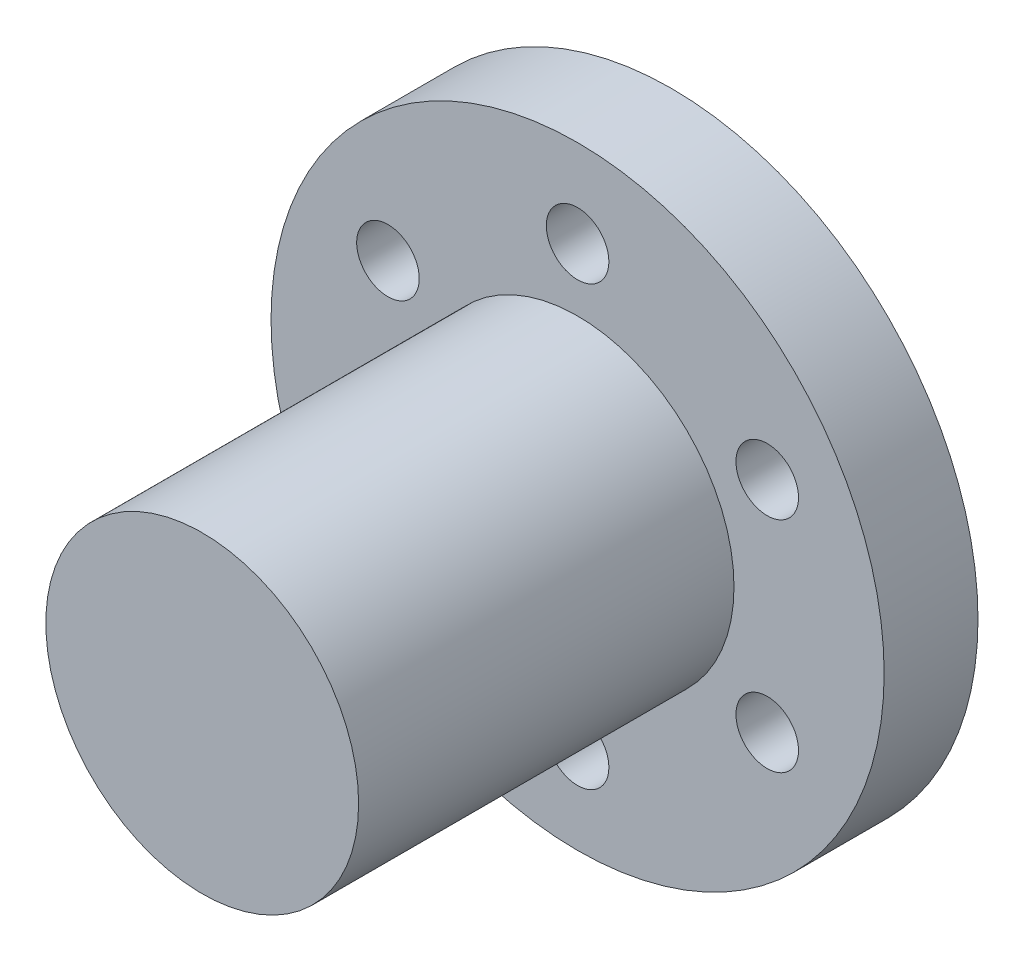
ISO-10303-21;
HEADER;
FILE_DESCRIPTION(('STEP AP214'),'2;1');
FILE_NAME('part.step','',(''),(''),'','','');
FILE_SCHEMA(('AUTOMOTIVE_DESIGN { 1 0 10303 214 1 1 1 1 }'));
ENDSEC;
DATA;
#1=APPLICATION_CONTEXT('core data for automotive mechanical design processes');
#2=APPLICATION_PROTOCOL_DEFINITION('international standard','automotive_design',2000,#1);
#3=PRODUCT_CONTEXT('',#1,'mechanical');
#4=PRODUCT('Part','Part','',(#3));
#5=PRODUCT_RELATED_PRODUCT_CATEGORY('part','',(#4));
#6=PRODUCT_DEFINITION_FORMATION('','',#4);
#7=PRODUCT_DEFINITION_CONTEXT('part definition',#1,'design');
#8=PRODUCT_DEFINITION('design','',#6,#7);
#9=PRODUCT_DEFINITION_SHAPE('','',#8);
#10=(LENGTH_UNIT() NAMED_UNIT(*) SI_UNIT(.MILLI.,.METRE.));
#11=(NAMED_UNIT(*) PLANE_ANGLE_UNIT() SI_UNIT($,.RADIAN.));
#12=(NAMED_UNIT(*) SI_UNIT($,.STERADIAN.) SOLID_ANGLE_UNIT());
#13=UNCERTAINTY_MEASURE_WITH_UNIT(LENGTH_MEASURE(1.E-05),#10,'distance_accuracy_value','');
#14=(GEOMETRIC_REPRESENTATION_CONTEXT(3) GLOBAL_UNCERTAINTY_ASSIGNED_CONTEXT((#13)) GLOBAL_UNIT_ASSIGNED_CONTEXT((#10,
#11,#12)) REPRESENTATION_CONTEXT('',''));
#15=CARTESIAN_POINT('',(0.,0.,0.));
#16=DIRECTION('',(0.,0.,1.));
#17=DIRECTION('',(1.,0.,0.));
#18=AXIS2_PLACEMENT_3D('',#15,#16,#17);
#19=CARTESIAN_POINT('',(0.,0.,190.5));
#20=DIRECTION('',(0.,0.,-1.));
#21=DIRECTION('',(-1.,0.,0.));
#22=AXIS2_PLACEMENT_3D('',#19,#20,#21);
#23=CYLINDRICAL_SURFACE('',#22,1244.6);
#24=CARTESIAN_POINT('',(0.,0.,190.5));
#25=DIRECTION('',(0.,0.,1.));
#26=DIRECTION('',(1.,0.,0.));
#27=AXIS2_PLACEMENT_3D('',#24,#25,#26);
#28=CIRCLE('',#27,1244.6);
#29=CARTESIAN_POINT('',(1244.6,0.,190.5));
#30=VERTEX_POINT('',#29);
#31=EDGE_CURVE('E10',#30,#30,#28,.T.);
#32=ORIENTED_EDGE('',*,*,#31,.F.);
#33=EDGE_LOOP('',(#32));
#34=FACE_BOUND('',#33,.T.);
#35=CARTESIAN_POINT('',(0.,0.,-190.5));
#36=DIRECTION('',(0.,0.,1.));
#37=DIRECTION('',(1.,0.,0.));
#38=AXIS2_PLACEMENT_3D('',#35,#36,#37);
#39=CIRCLE('',#38,1244.6);
#40=CARTESIAN_POINT('',(1244.6,0.,-190.5));
#41=VERTEX_POINT('',#40);
#42=EDGE_CURVE('E38',#41,#41,#39,.T.);
#43=ORIENTED_EDGE('',*,*,#42,.T.);
#44=EDGE_LOOP('',(#43));
#45=FACE_BOUND('',#44,.T.);
#46=ADVANCED_FACE('F35',(#34,#45),#23,.T.);
#47=CARTESIAN_POINT('',(0.,0.,190.5));
#48=DIRECTION('',(0.,0.,1.));
#49=DIRECTION('',(1.,0.,0.));
#50=AXIS2_PLACEMENT_3D('',#47,#48,#49);
#51=PLANE('',#50);
#52=CARTESIAN_POINT('',(0.,0.,190.5));
#53=DIRECTION('',(0.,0.,1.));
#54=DIRECTION('',(1.,0.,0.));
#55=AXIS2_PLACEMENT_3D('',#52,#53,#54);
#56=CIRCLE('',#55,635.);
#57=CARTESIAN_POINT('',(635.,0.,190.5));
#58=VERTEX_POINT('',#57);
#59=EDGE_CURVE('E83',#58,#58,#56,.T.);
#60=ORIENTED_EDGE('',*,*,#59,.F.);
#61=EDGE_LOOP('',(#60));
#62=FACE_BOUND('',#61,.T.);
#63=CARTESIAN_POINT('',(0.,889.,190.5));
#64=DIRECTION('',(0.,0.,1.));
#65=DIRECTION('',(1.,0.,0.));
#66=AXIS2_PLACEMENT_3D('',#63,#64,#65);
#67=CIRCLE('',#66,127.);
#68=CARTESIAN_POINT('',(127.,889.,190.5));
#69=VERTEX_POINT('',#68);
#70=EDGE_CURVE('E72',#69,#69,#67,.T.);
#71=ORIENTED_EDGE('',*,*,#70,.F.);
#72=EDGE_LOOP('',(#71));
#73=FACE_BOUND('',#72,.T.);
#74=CARTESIAN_POINT('',(-769.896583964366,444.499999999999,190.5));
#75=DIRECTION('',(0.,0.,1.));
#76=DIRECTION('',(1.,0.,0.));
#77=AXIS2_PLACEMENT_3D('',#74,#75,#76);
#78=CIRCLE('',#77,127.000000000011);
#79=CARTESIAN_POINT('',(-642.896583964356,444.499999999999,190.5));
#80=VERTEX_POINT('',#79);
#81=EDGE_CURVE('E51',#80,#80,#78,.T.);
#82=ORIENTED_EDGE('',*,*,#81,.F.);
#83=EDGE_LOOP('',(#82));
#84=FACE_BOUND('',#83,.T.);
#85=CARTESIAN_POINT('',(-769.896583964366,-444.5,190.5));
#86=DIRECTION('',(0.,0.,1.));
#87=DIRECTION('',(1.,0.,0.));
#88=AXIS2_PLACEMENT_3D('',#85,#86,#87);
#89=CIRCLE('',#88,127.000000000008);
#90=CARTESIAN_POINT('',(-642.896583964358,-444.5,190.5));
#91=VERTEX_POINT('',#90);
#92=EDGE_CURVE('E50',#91,#91,#89,.T.);
#93=ORIENTED_EDGE('',*,*,#92,.F.);
#94=EDGE_LOOP('',(#93));
#95=FACE_BOUND('',#94,.T.);
#96=CARTESIAN_POINT('',(0.,-889.,190.5));
#97=DIRECTION('',(0.,0.,1.));
#98=DIRECTION('',(1.,0.,0.));
#99=AXIS2_PLACEMENT_3D('',#96,#97,#98);
#100=CIRCLE('',#99,127.000000000006);
#101=CARTESIAN_POINT('',(127.000000000006,-889.,190.5));
#102=VERTEX_POINT('',#101);
#103=EDGE_CURVE('E57',#102,#102,#100,.T.);
#104=ORIENTED_EDGE('',*,*,#103,.F.);
#105=EDGE_LOOP('',(#104));
#106=FACE_BOUND('',#105,.T.);
#107=CARTESIAN_POINT('',(769.896583964366,-444.5,190.5));
#108=DIRECTION('',(0.,0.,1.));
#109=DIRECTION('',(1.,0.,0.));
#110=AXIS2_PLACEMENT_3D('',#107,#108,#109);
#111=CIRCLE('',#110,127.000000000004);
#112=CARTESIAN_POINT('',(896.896583964371,-444.5,190.5));
#113=VERTEX_POINT('',#112);
#114=EDGE_CURVE('E63',#113,#113,#111,.T.);
#115=ORIENTED_EDGE('',*,*,#114,.F.);
#116=EDGE_LOOP('',(#115));
#117=FACE_BOUND('',#116,.T.);
#118=CARTESIAN_POINT('',(769.896583964366,444.5,190.5));
#119=DIRECTION('',(0.,0.,1.));
#120=DIRECTION('',(1.,0.,0.));
#121=AXIS2_PLACEMENT_3D('',#118,#119,#120);
#122=CIRCLE('',#121,127.000000000002);
#123=CARTESIAN_POINT('',(896.896583964368,444.5,190.5));
#124=VERTEX_POINT('',#123);
#125=EDGE_CURVE('E69',#124,#124,#122,.T.);
#126=ORIENTED_EDGE('',*,*,#125,.F.);
#127=EDGE_LOOP('',(#126));
#128=FACE_BOUND('',#127,.T.);
#129=ORIENTED_EDGE('',*,*,#31,.T.);
#130=EDGE_LOOP('',(#129));
#131=FACE_BOUND('',#130,.T.);
#132=ADVANCED_FACE('F98',(#62,#73,#84,#95,#106,#117,#128,#131),#51,.T.);
#133=CARTESIAN_POINT('',(0.,0.,-190.5));
#134=DIRECTION('',(0.,0.,1.));
#135=DIRECTION('',(1.,0.,0.));
#136=AXIS2_PLACEMENT_3D('',#133,#134,#135);
#137=PLANE('',#136);
#138=CARTESIAN_POINT('',(0.,889.,-190.5));
#139=DIRECTION('',(0.,0.,1.));
#140=DIRECTION('',(1.,0.,0.));
#141=AXIS2_PLACEMENT_3D('',#138,#139,#140);
#142=CIRCLE('',#141,127.);
#143=CARTESIAN_POINT('',(127.,889.,-190.5));
#144=VERTEX_POINT('',#143);
#145=EDGE_CURVE('E45',#144,#144,#142,.T.);
#146=ORIENTED_EDGE('',*,*,#145,.T.);
#147=EDGE_LOOP('',(#146));
#148=FACE_BOUND('',#147,.T.);
#149=CARTESIAN_POINT('',(-769.896583964366,444.499999999999,-190.5));
#150=DIRECTION('',(0.,0.,1.));
#151=DIRECTION('',(1.,0.,0.));
#152=AXIS2_PLACEMENT_3D('',#149,#150,#151);
#153=CIRCLE('',#152,127.000000000011);
#154=CARTESIAN_POINT('',(-642.896583964356,444.499999999999,-190.5));
#155=VERTEX_POINT('',#154);
#156=EDGE_CURVE('E73',#155,#155,#153,.T.);
#157=ORIENTED_EDGE('',*,*,#156,.T.);
#158=EDGE_LOOP('',(#157));
#159=FACE_BOUND('',#158,.T.);
#160=CARTESIAN_POINT('',(-769.896583964366,-444.5,-190.5));
#161=DIRECTION('',(0.,0.,1.));
#162=DIRECTION('',(1.,0.,0.));
#163=AXIS2_PLACEMENT_3D('',#160,#161,#162);
#164=CIRCLE('',#163,127.000000000008);
#165=CARTESIAN_POINT('',(-642.896583964358,-444.5,-190.5));
#166=VERTEX_POINT('',#165);
#167=EDGE_CURVE('E47',#166,#166,#164,.T.);
#168=ORIENTED_EDGE('',*,*,#167,.T.);
#169=EDGE_LOOP('',(#168));
#170=FACE_BOUND('',#169,.T.);
#171=CARTESIAN_POINT('',(0.,-889.,-190.5));
#172=DIRECTION('',(0.,0.,1.));
#173=DIRECTION('',(1.,0.,0.));
#174=AXIS2_PLACEMENT_3D('',#171,#172,#173);
#175=CIRCLE('',#174,127.000000000006);
#176=CARTESIAN_POINT('',(127.000000000006,-889.,-190.5));
#177=VERTEX_POINT('',#176);
#178=EDGE_CURVE('E54',#177,#177,#175,.T.);
#179=ORIENTED_EDGE('',*,*,#178,.T.);
#180=EDGE_LOOP('',(#179));
#181=FACE_BOUND('',#180,.T.);
#182=CARTESIAN_POINT('',(769.896583964366,-444.5,-190.5));
#183=DIRECTION('',(0.,0.,1.));
#184=DIRECTION('',(1.,0.,0.));
#185=AXIS2_PLACEMENT_3D('',#182,#183,#184);
#186=CIRCLE('',#185,127.000000000004);
#187=CARTESIAN_POINT('',(896.896583964371,-444.5,-190.5));
#188=VERTEX_POINT('',#187);
#189=EDGE_CURVE('E60',#188,#188,#186,.T.);
#190=ORIENTED_EDGE('',*,*,#189,.T.);
#191=EDGE_LOOP('',(#190));
#192=FACE_BOUND('',#191,.T.);
#193=CARTESIAN_POINT('',(769.896583964366,444.5,-190.5));
#194=DIRECTION('',(0.,0.,1.));
#195=DIRECTION('',(1.,0.,0.));
#196=AXIS2_PLACEMENT_3D('',#193,#194,#195);
#197=CIRCLE('',#196,127.000000000002);
#198=CARTESIAN_POINT('',(896.896583964368,444.5,-190.5));
#199=VERTEX_POINT('',#198);
#200=EDGE_CURVE('E66',#199,#199,#197,.T.);
#201=ORIENTED_EDGE('',*,*,#200,.T.);
#202=EDGE_LOOP('',(#201));
#203=FACE_BOUND('',#202,.T.);
#204=ORIENTED_EDGE('',*,*,#42,.F.);
#205=EDGE_LOOP('',(#204));
#206=FACE_BOUND('',#205,.T.);
#207=ADVANCED_FACE('F101',(#148,#159,#170,#181,#192,#203,#206),#137,.F.);
#208=CARTESIAN_POINT('',(769.896583964366,444.5,-190.5));
#209=DIRECTION('',(0.,0.,1.));
#210=DIRECTION('',(1.,0.,0.));
#211=AXIS2_PLACEMENT_3D('',#208,#209,#210);
#212=CYLINDRICAL_SURFACE('',#211,127.000000000002);
#213=ORIENTED_EDGE('',*,*,#200,.F.);
#214=EDGE_LOOP('',(#213));
#215=FACE_BOUND('',#214,.T.);
#216=ORIENTED_EDGE('',*,*,#125,.T.);
#217=EDGE_LOOP('',(#216));
#218=FACE_BOUND('',#217,.T.);
#219=ADVANCED_FACE('F115',(#215,#218),#212,.F.);
#220=CARTESIAN_POINT('',(769.896583964366,-444.5,-190.5));
#221=DIRECTION('',(0.,0.,1.));
#222=DIRECTION('',(1.,0.,0.));
#223=AXIS2_PLACEMENT_3D('',#220,#221,#222);
#224=CYLINDRICAL_SURFACE('',#223,127.000000000004);
#225=ORIENTED_EDGE('',*,*,#189,.F.);
#226=EDGE_LOOP('',(#225));
#227=FACE_BOUND('',#226,.T.);
#228=ORIENTED_EDGE('',*,*,#114,.T.);
#229=EDGE_LOOP('',(#228));
#230=FACE_BOUND('',#229,.T.);
#231=ADVANCED_FACE('F117',(#227,#230),#224,.F.);
#232=CARTESIAN_POINT('',(0.,-889.,-190.5));
#233=DIRECTION('',(0.,0.,1.));
#234=DIRECTION('',(1.,0.,0.));
#235=AXIS2_PLACEMENT_3D('',#232,#233,#234);
#236=CYLINDRICAL_SURFACE('',#235,127.000000000006);
#237=ORIENTED_EDGE('',*,*,#178,.F.);
#238=EDGE_LOOP('',(#237));
#239=FACE_BOUND('',#238,.T.);
#240=ORIENTED_EDGE('',*,*,#103,.T.);
#241=EDGE_LOOP('',(#240));
#242=FACE_BOUND('',#241,.T.);
#243=ADVANCED_FACE('F124',(#239,#242),#236,.F.);
#244=CARTESIAN_POINT('',(-769.896583964366,-444.5,-190.5));
#245=DIRECTION('',(0.,0.,1.));
#246=DIRECTION('',(1.,0.,0.));
#247=AXIS2_PLACEMENT_3D('',#244,#245,#246);
#248=CYLINDRICAL_SURFACE('',#247,127.000000000008);
#249=ORIENTED_EDGE('',*,*,#167,.F.);
#250=EDGE_LOOP('',(#249));
#251=FACE_BOUND('',#250,.T.);
#252=ORIENTED_EDGE('',*,*,#92,.T.);
#253=EDGE_LOOP('',(#252));
#254=FACE_BOUND('',#253,.T.);
#255=ADVANCED_FACE('F169',(#251,#254),#248,.F.);
#256=CARTESIAN_POINT('',(-769.896583964366,444.499999999999,-190.5));
#257=DIRECTION('',(0.,0.,1.));
#258=DIRECTION('',(1.,0.,0.));
#259=AXIS2_PLACEMENT_3D('',#256,#257,#258);
#260=CYLINDRICAL_SURFACE('',#259,127.000000000011);
#261=ORIENTED_EDGE('',*,*,#156,.F.);
#262=EDGE_LOOP('',(#261));
#263=FACE_BOUND('',#262,.T.);
#264=ORIENTED_EDGE('',*,*,#81,.T.);
#265=EDGE_LOOP('',(#264));
#266=FACE_BOUND('',#265,.T.);
#267=ADVANCED_FACE('F180',(#263,#266),#260,.F.);
#268=CARTESIAN_POINT('',(0.,889.,-190.5));
#269=DIRECTION('',(0.,0.,1.));
#270=DIRECTION('',(1.,0.,0.));
#271=AXIS2_PLACEMENT_3D('',#268,#269,#270);
#272=CYLINDRICAL_SURFACE('',#271,127.);
#273=ORIENTED_EDGE('',*,*,#145,.F.);
#274=EDGE_LOOP('',(#273));
#275=FACE_BOUND('',#274,.T.);
#276=ORIENTED_EDGE('',*,*,#70,.T.);
#277=EDGE_LOOP('',(#276));
#278=FACE_BOUND('',#277,.T.);
#279=ADVANCED_FACE('F94',(#275,#278),#272,.F.);
#280=CARTESIAN_POINT('',(0.,0.,1714.5));
#281=DIRECTION('',(0.,0.,-1.));
#282=DIRECTION('',(-1.,0.,0.));
#283=AXIS2_PLACEMENT_3D('',#280,#281,#282);
#284=CYLINDRICAL_SURFACE('',#283,635.);
#285=CARTESIAN_POINT('',(0.,0.,1714.5));
#286=DIRECTION('',(0.,0.,1.));
#287=DIRECTION('',(1.,0.,0.));
#288=AXIS2_PLACEMENT_3D('',#285,#286,#287);
#289=CIRCLE('',#288,635.);
#290=CARTESIAN_POINT('',(635.,0.,1714.5));
#291=VERTEX_POINT('',#290);
#292=EDGE_CURVE('E76',#291,#291,#289,.T.);
#293=ORIENTED_EDGE('',*,*,#292,.F.);
#294=EDGE_LOOP('',(#293));
#295=FACE_BOUND('',#294,.T.);
#296=ORIENTED_EDGE('',*,*,#59,.T.);
#297=EDGE_LOOP('',(#296));
#298=FACE_BOUND('',#297,.T.);
#299=ADVANCED_FACE('F91',(#295,#298),#284,.T.);
#300=CARTESIAN_POINT('',(0.,0.,1714.5));
#301=DIRECTION('',(0.,0.,1.));
#302=DIRECTION('',(1.,0.,0.));
#303=AXIS2_PLACEMENT_3D('',#300,#301,#302);
#304=PLANE('',#303);
#305=ORIENTED_EDGE('',*,*,#292,.T.);
#306=EDGE_LOOP('',(#305));
#307=FACE_BOUND('',#306,.T.);
#308=ADVANCED_FACE('F89',(#307),#304,.T.);
#309=CLOSED_SHELL('',(#46,#132,#207,#219,#231,#243,#255,#267,#279,#299,#308));
#310=MANIFOLD_SOLID_BREP('B2',#309);
#311=ADVANCED_BREP_SHAPE_REPRESENTATION('',(#18,#310),#14);
#312=SHAPE_DEFINITION_REPRESENTATION(#9,#311);
ENDSEC;
END-ISO-10303-21;
